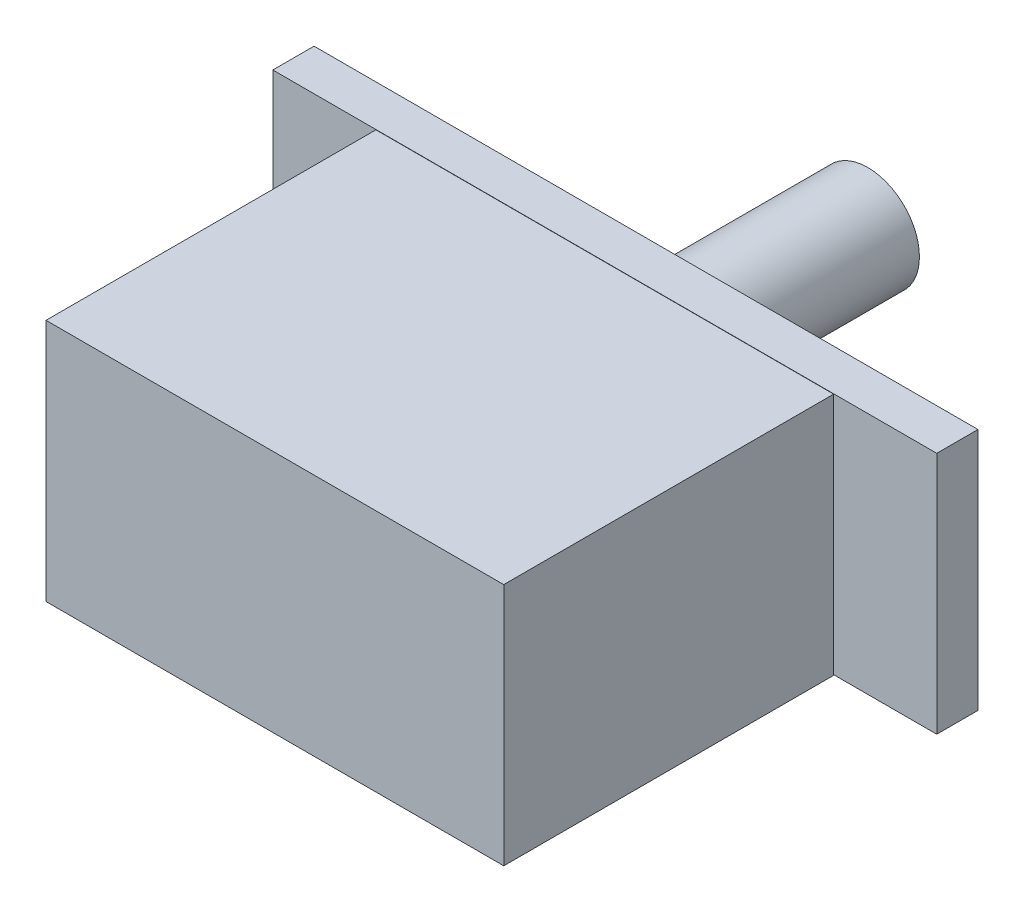
ISO-10303-21;
HEADER;
FILE_DESCRIPTION(('STEP AP214'),'2;1');
FILE_NAME('part.step','',(''),(''),'','','');
FILE_SCHEMA(('AUTOMOTIVE_DESIGN { 1 0 10303 214 1 1 1 1 }'));
ENDSEC;
DATA;
#1=APPLICATION_CONTEXT('core data for automotive mechanical design processes');
#2=APPLICATION_PROTOCOL_DEFINITION('international standard','automotive_design',2000,#1);
#3=PRODUCT_CONTEXT('',#1,'mechanical');
#4=PRODUCT('Part','Part','',(#3));
#5=PRODUCT_RELATED_PRODUCT_CATEGORY('part','',(#4));
#6=PRODUCT_DEFINITION_FORMATION('','',#4);
#7=PRODUCT_DEFINITION_CONTEXT('part definition',#1,'design');
#8=PRODUCT_DEFINITION('design','',#6,#7);
#9=PRODUCT_DEFINITION_SHAPE('','',#8);
#10=(LENGTH_UNIT() NAMED_UNIT(*) SI_UNIT(.MILLI.,.METRE.));
#11=(NAMED_UNIT(*) PLANE_ANGLE_UNIT() SI_UNIT($,.RADIAN.));
#12=(NAMED_UNIT(*) SI_UNIT($,.STERADIAN.) SOLID_ANGLE_UNIT());
#13=UNCERTAINTY_MEASURE_WITH_UNIT(LENGTH_MEASURE(1.E-05),#10,'distance_accuracy_value','');
#14=(GEOMETRIC_REPRESENTATION_CONTEXT(3) GLOBAL_UNCERTAINTY_ASSIGNED_CONTEXT((#13)) GLOBAL_UNIT_ASSIGNED_CONTEXT((#10,
#11,#12)) REPRESENTATION_CONTEXT('',''));
#15=CARTESIAN_POINT('',(0.,0.,0.));
#16=DIRECTION('',(0.,0.,1.));
#17=DIRECTION('',(1.,0.,0.));
#18=AXIS2_PLACEMENT_3D('',#15,#16,#17);
#19=CARTESIAN_POINT('',(-65.3546528013582,-7.07750424448215,2.));
#20=DIRECTION('',(1.,0.,0.));
#21=DIRECTION('',(0.,0.,-1.));
#22=AXIS2_PLACEMENT_3D('',#19,#20,#21);
#23=PLANE('',#22);
#24=DIRECTION('',(0.,-1.,0.));
#25=VECTOR('',#24,1.);
#26=CARTESIAN_POINT('',(-65.3546528013582,-7.07750424448215,0.));
#27=LINE('',#26,#25);
#28=CARTESIAN_POINT('',(-65.3546528013582,-7.07750424448215,0.));
#29=VERTEX_POINT('',#28);
#30=CARTESIAN_POINT('',(-65.3546528013582,-18.8775042444822,0.));
#31=VERTEX_POINT('',#30);
#32=EDGE_CURVE('E127',#29,#31,#27,.T.);
#33=ORIENTED_EDGE('',*,*,#32,.T.);
#34=DIRECTION('',(0.,0.,-1.));
#35=VECTOR('',#34,1.);
#36=CARTESIAN_POINT('',(-65.3546528013582,-18.8775042444822,2.));
#37=LINE('',#36,#35);
#38=CARTESIAN_POINT('',(-65.3546528013582,-18.8775042444822,2.));
#39=VERTEX_POINT('',#38);
#40=EDGE_CURVE('E160',#39,#31,#37,.T.);
#41=ORIENTED_EDGE('',*,*,#40,.F.);
#42=DIRECTION('',(0.,-1.,0.));
#43=VECTOR('',#42,1.);
#44=CARTESIAN_POINT('',(-65.3546528013582,-7.07750424448215,2.));
#45=LINE('',#44,#43);
#46=CARTESIAN_POINT('',(-65.3546528013582,-7.07750424448215,2.));
#47=VERTEX_POINT('',#46);
#48=EDGE_CURVE('E136',#47,#39,#45,.T.);
#49=ORIENTED_EDGE('',*,*,#48,.F.);
#50=DIRECTION('',(0.,0.,-1.));
#51=VECTOR('',#50,1.);
#52=CARTESIAN_POINT('',(-65.3546528013582,-7.07750424448215,2.));
#53=LINE('',#52,#51);
#54=EDGE_CURVE('E147',#47,#29,#53,.T.);
#55=ORIENTED_EDGE('',*,*,#54,.T.);
#56=EDGE_LOOP('',(#33,#41,#49,#55));
#57=FACE_BOUND('',#56,.T.);
#58=ADVANCED_FACE('F33',(#57),#23,.F.);
#59=CARTESIAN_POINT('',(-65.3546528013582,-18.8775042444822,2.));
#60=DIRECTION('',(0.,1.,0.));
#61=DIRECTION('',(0.,0.,1.));
#62=AXIS2_PLACEMENT_3D('',#59,#60,#61);
#63=PLANE('',#62);
#64=DIRECTION('',(1.,0.,0.));
#65=VECTOR('',#64,1.);
#66=CARTESIAN_POINT('',(-65.3546528013582,-18.8775042444822,0.));
#67=LINE('',#66,#65);
#68=CARTESIAN_POINT('',(-33.1546528013582,-18.8775042444822,0.));
#69=VERTEX_POINT('',#68);
#70=EDGE_CURVE('E130',#31,#69,#67,.T.);
#71=ORIENTED_EDGE('',*,*,#70,.T.);
#72=DIRECTION('',(0.,0.,-1.));
#73=VECTOR('',#72,1.);
#74=CARTESIAN_POINT('',(-33.1546528013582,-18.8775042444822,2.));
#75=LINE('',#74,#73);
#76=CARTESIAN_POINT('',(-33.1546528013582,-18.8775042444822,2.));
#77=VERTEX_POINT('',#76);
#78=EDGE_CURVE('E158',#77,#69,#75,.T.);
#79=ORIENTED_EDGE('',*,*,#78,.F.);
#80=DIRECTION('',(1.,0.,0.));
#81=VECTOR('',#80,1.);
#82=CARTESIAN_POINT('',(-65.3546528013582,-18.8775042444822,2.));
#83=LINE('',#82,#81);
#84=CARTESIAN_POINT('',(-38.1546528013582,-18.8775042444822,2.));
#85=VERTEX_POINT('',#84);
#86=EDGE_CURVE('E139',#85,#77,#83,.T.);
#87=ORIENTED_EDGE('',*,*,#86,.F.);
#88=CARTESIAN_POINT('',(-60.3546528013582,-18.8775042444822,2.));
#89=VERTEX_POINT('',#88);
#90=EDGE_CURVE('E144',#89,#85,#83,.T.);
#91=ORIENTED_EDGE('',*,*,#90,.F.);
#92=EDGE_CURVE('E141',#39,#89,#83,.T.);
#93=ORIENTED_EDGE('',*,*,#92,.F.);
#94=ORIENTED_EDGE('',*,*,#40,.T.);
#95=EDGE_LOOP('',(#71,#79,#87,#91,#93,#94));
#96=FACE_BOUND('',#95,.T.);
#97=ADVANCED_FACE('F211',(#96),#63,.F.);
#98=CARTESIAN_POINT('',(-33.1546528013582,-7.07750424448215,2.));
#99=DIRECTION('',(-1.,0.,0.));
#100=DIRECTION('',(0.,0.,1.));
#101=AXIS2_PLACEMENT_3D('',#98,#99,#100);
#102=PLANE('',#101);
#103=DIRECTION('',(0.,1.,0.));
#104=VECTOR('',#103,1.);
#105=CARTESIAN_POINT('',(-33.1546528013582,-7.07750424448215,0.));
#106=LINE('',#105,#104);
#107=CARTESIAN_POINT('',(-33.1546528013582,-7.07750424448215,0.));
#108=VERTEX_POINT('',#107);
#109=EDGE_CURVE('E150',#69,#108,#106,.T.);
#110=ORIENTED_EDGE('',*,*,#109,.T.);
#111=DIRECTION('',(0.,0.,-1.));
#112=VECTOR('',#111,1.);
#113=CARTESIAN_POINT('',(-33.1546528013582,-7.07750424448215,2.));
#114=LINE('',#113,#112);
#115=CARTESIAN_POINT('',(-33.1546528013582,-7.07750424448215,2.));
#116=VERTEX_POINT('',#115);
#117=EDGE_CURVE('E155',#116,#108,#114,.T.);
#118=ORIENTED_EDGE('',*,*,#117,.F.);
#119=DIRECTION('',(0.,1.,0.));
#120=VECTOR('',#119,1.);
#121=CARTESIAN_POINT('',(-33.1546528013582,-7.07750424448215,2.));
#122=LINE('',#121,#120);
#123=EDGE_CURVE('E143',#77,#116,#122,.T.);
#124=ORIENTED_EDGE('',*,*,#123,.F.);
#125=ORIENTED_EDGE('',*,*,#78,.T.);
#126=EDGE_LOOP('',(#110,#118,#124,#125));
#127=FACE_BOUND('',#126,.T.);
#128=ADVANCED_FACE('F209',(#127),#102,.F.);
#129=CARTESIAN_POINT('',(-65.3546528013582,-7.07750424448215,2.));
#130=DIRECTION('',(0.,-1.,0.));
#131=DIRECTION('',(0.,0.,-1.));
#132=AXIS2_PLACEMENT_3D('',#129,#130,#131);
#133=PLANE('',#132);
#134=DIRECTION('',(-1.,0.,0.));
#135=VECTOR('',#134,1.);
#136=CARTESIAN_POINT('',(-65.3546528013582,-7.07750424448215,0.));
#137=LINE('',#136,#135);
#138=EDGE_CURVE('E140',#108,#29,#137,.T.);
#139=ORIENTED_EDGE('',*,*,#138,.T.);
#140=ORIENTED_EDGE('',*,*,#54,.F.);
#141=DIRECTION('',(-1.,0.,0.));
#142=VECTOR('',#141,1.);
#143=CARTESIAN_POINT('',(-65.3546528013582,-7.07750424448215,2.));
#144=LINE('',#143,#142);
#145=EDGE_CURVE('E146',#116,#47,#144,.T.);
#146=ORIENTED_EDGE('',*,*,#145,.F.);
#147=ORIENTED_EDGE('',*,*,#117,.T.);
#148=EDGE_LOOP('',(#139,#140,#146,#147));
#149=FACE_BOUND('',#148,.T.);
#150=ADVANCED_FACE('F205',(#149),#133,.F.);
#151=CARTESIAN_POINT('',(0.,0.,2.));
#152=DIRECTION('',(0.,0.,1.));
#153=DIRECTION('',(1.,0.,0.));
#154=AXIS2_PLACEMENT_3D('',#151,#152,#153);
#155=PLANE('',#154);
#156=DIRECTION('',(0.,-1.,0.));
#157=VECTOR('',#156,1.);
#158=CARTESIAN_POINT('',(-60.3546528013582,-18.9041740383686,2.));
#159=LINE('',#158,#157);
#160=CARTESIAN_POINT('',(-60.3546528013582,-7.09157997573584,2.));
#161=VERTEX_POINT('',#160);
#162=EDGE_CURVE('E47',#161,#89,#159,.T.);
#163=ORIENTED_EDGE('',*,*,#162,.F.);
#164=DIRECTION('',(-1.,0.,0.));
#165=VECTOR('',#164,1.);
#166=CARTESIAN_POINT('',(-60.3546528013582,-7.09157997573584,2.));
#167=LINE('',#166,#165);
#168=CARTESIAN_POINT('',(-38.1546528013582,-7.09157997573584,2.));
#169=VERTEX_POINT('',#168);
#170=EDGE_CURVE('E121',#169,#161,#167,.T.);
#171=ORIENTED_EDGE('',*,*,#170,.F.);
#172=DIRECTION('',(0.,1.,0.));
#173=VECTOR('',#172,1.);
#174=CARTESIAN_POINT('',(-38.1546528013582,-18.9041740383686,2.));
#175=LINE('',#174,#173);
#176=EDGE_CURVE('E40',#85,#169,#175,.T.);
#177=ORIENTED_EDGE('',*,*,#176,.F.);
#178=ORIENTED_EDGE('',*,*,#86,.T.);
#179=ORIENTED_EDGE('',*,*,#123,.T.);
#180=ORIENTED_EDGE('',*,*,#145,.T.);
#181=ORIENTED_EDGE('',*,*,#48,.T.);
#182=ORIENTED_EDGE('',*,*,#92,.T.);
#183=EDGE_LOOP('',(#163,#171,#177,#178,#179,#180,#181,#182));
#184=FACE_BOUND('',#183,.T.);
#185=ADVANCED_FACE('F195',(#184),#155,.T.);
#186=CARTESIAN_POINT('',(0.,0.,0.));
#187=DIRECTION('',(0.,0.,1.));
#188=DIRECTION('',(1.,0.,0.));
#189=AXIS2_PLACEMENT_3D('',#186,#187,#188);
#190=PLANE('',#189);
#191=CARTESIAN_POINT('',(-50.495961023401,-13.245250527973,0.));
#192=DIRECTION('',(0.,0.,1.));
#193=DIRECTION('',(1.,0.,0.));
#194=AXIS2_PLACEMENT_3D('',#191,#192,#193);
#195=CIRCLE('',#194,2.5);
#196=CARTESIAN_POINT('',(-47.995961023401,-13.245250527973,0.));
#197=VERTEX_POINT('',#196);
#198=EDGE_CURVE('E11',#197,#197,#195,.F.);
#199=ORIENTED_EDGE('',*,*,#198,.F.);
#200=EDGE_LOOP('',(#199));
#201=FACE_BOUND('',#200,.T.);
#202=ORIENTED_EDGE('',*,*,#32,.F.);
#203=ORIENTED_EDGE('',*,*,#138,.F.);
#204=ORIENTED_EDGE('',*,*,#109,.F.);
#205=ORIENTED_EDGE('',*,*,#70,.F.);
#206=EDGE_LOOP('',(#202,#203,#204,#205));
#207=FACE_BOUND('',#206,.T.);
#208=ADVANCED_FACE('F192',(#201,#207),#190,.F.);
#209=CARTESIAN_POINT('',(-60.3546528013582,-18.9041740383686,18.));
#210=DIRECTION('',(1.,0.,0.));
#211=DIRECTION('',(0.,0.,-1.));
#212=AXIS2_PLACEMENT_3D('',#209,#210,#211);
#213=PLANE('',#212);
#214=ORIENTED_EDGE('',*,*,#162,.T.);
#215=CARTESIAN_POINT('',(-60.3546528013582,-18.9041740383686,2.));
#216=VERTEX_POINT('',#215);
#217=EDGE_CURVE('E125',#89,#216,#159,.T.);
#218=ORIENTED_EDGE('',*,*,#217,.T.);
#219=DIRECTION('',(0.,0.,-1.));
#220=VECTOR('',#219,1.);
#221=CARTESIAN_POINT('',(-60.3546528013582,-18.9041740383686,18.));
#222=LINE('',#221,#220);
#223=CARTESIAN_POINT('',(-60.3546528013582,-18.9041740383686,18.));
#224=VERTEX_POINT('',#223);
#225=EDGE_CURVE('E106',#224,#216,#222,.T.);
#226=ORIENTED_EDGE('',*,*,#225,.F.);
#227=DIRECTION('',(0.,-1.,0.));
#228=VECTOR('',#227,1.);
#229=CARTESIAN_POINT('',(-60.3546528013582,-18.9041740383686,18.));
#230=LINE('',#229,#228);
#231=CARTESIAN_POINT('',(-60.3546528013582,-7.09157997573584,18.));
#232=VERTEX_POINT('',#231);
#233=EDGE_CURVE('E112',#232,#224,#230,.T.);
#234=ORIENTED_EDGE('',*,*,#233,.F.);
#235=DIRECTION('',(0.,0.,-1.));
#236=VECTOR('',#235,1.);
#237=CARTESIAN_POINT('',(-60.3546528013582,-7.09157997573584,18.));
#238=LINE('',#237,#236);
#239=EDGE_CURVE('E177',#232,#161,#238,.T.);
#240=ORIENTED_EDGE('',*,*,#239,.T.);
#241=EDGE_LOOP('',(#214,#218,#226,#234,#240));
#242=FACE_BOUND('',#241,.T.);
#243=ADVANCED_FACE('F123',(#242),#213,.F.);
#244=CARTESIAN_POINT('',(-60.3546528013582,-18.9041740383686,18.));
#245=DIRECTION('',(0.,1.,0.));
#246=DIRECTION('',(0.,0.,1.));
#247=AXIS2_PLACEMENT_3D('',#244,#245,#246);
#248=PLANE('',#247);
#249=DIRECTION('',(1.,0.,0.));
#250=VECTOR('',#249,1.);
#251=CARTESIAN_POINT('',(-60.3546528013582,-18.9041740383686,2.));
#252=LINE('',#251,#250);
#253=CARTESIAN_POINT('',(-38.1546528013582,-18.9041740383686,2.));
#254=VERTEX_POINT('',#253);
#255=EDGE_CURVE('E172',#216,#254,#252,.T.);
#256=ORIENTED_EDGE('',*,*,#255,.T.);
#257=DIRECTION('',(0.,0.,-1.));
#258=VECTOR('',#257,1.);
#259=CARTESIAN_POINT('',(-38.1546528013582,-18.9041740383686,18.));
#260=LINE('',#259,#258);
#261=CARTESIAN_POINT('',(-38.1546528013582,-18.9041740383686,18.));
#262=VERTEX_POINT('',#261);
#263=EDGE_CURVE('E108',#262,#254,#260,.T.);
#264=ORIENTED_EDGE('',*,*,#263,.F.);
#265=DIRECTION('',(1.,0.,0.));
#266=VECTOR('',#265,1.);
#267=CARTESIAN_POINT('',(-60.3546528013582,-18.9041740383686,18.));
#268=LINE('',#267,#266);
#269=EDGE_CURVE('E102',#224,#262,#268,.T.);
#270=ORIENTED_EDGE('',*,*,#269,.F.);
#271=ORIENTED_EDGE('',*,*,#225,.T.);
#272=EDGE_LOOP('',(#256,#264,#270,#271));
#273=FACE_BOUND('',#272,.T.);
#274=ADVANCED_FACE('F104',(#273),#248,.F.);
#275=CARTESIAN_POINT('',(-38.1546528013582,-18.9041740383686,18.));
#276=DIRECTION('',(-1.,0.,0.));
#277=DIRECTION('',(0.,0.,1.));
#278=AXIS2_PLACEMENT_3D('',#275,#276,#277);
#279=PLANE('',#278);
#280=EDGE_CURVE('E165',#254,#85,#175,.T.);
#281=ORIENTED_EDGE('',*,*,#280,.T.);
#282=ORIENTED_EDGE('',*,*,#176,.T.);
#283=DIRECTION('',(0.,0.,-1.));
#284=VECTOR('',#283,1.);
#285=CARTESIAN_POINT('',(-38.1546528013582,-7.09157997573584,18.));
#286=LINE('',#285,#284);
#287=CARTESIAN_POINT('',(-38.1546528013582,-7.09157997573584,18.));
#288=VERTEX_POINT('',#287);
#289=EDGE_CURVE('E132',#288,#169,#286,.T.);
#290=ORIENTED_EDGE('',*,*,#289,.F.);
#291=DIRECTION('',(0.,1.,0.));
#292=VECTOR('',#291,1.);
#293=CARTESIAN_POINT('',(-38.1546528013582,-18.9041740383686,18.));
#294=LINE('',#293,#292);
#295=EDGE_CURVE('E111',#262,#288,#294,.T.);
#296=ORIENTED_EDGE('',*,*,#295,.F.);
#297=ORIENTED_EDGE('',*,*,#263,.T.);
#298=EDGE_LOOP('',(#281,#282,#290,#296,#297));
#299=FACE_BOUND('',#298,.T.);
#300=ADVANCED_FACE('F217',(#299),#279,.F.);
#301=CARTESIAN_POINT('',(-60.3546528013582,-7.09157997573584,18.));
#302=DIRECTION('',(0.,-1.,0.));
#303=DIRECTION('',(0.,0.,-1.));
#304=AXIS2_PLACEMENT_3D('',#301,#302,#303);
#305=PLANE('',#304);
#306=ORIENTED_EDGE('',*,*,#170,.T.);
#307=ORIENTED_EDGE('',*,*,#239,.F.);
#308=DIRECTION('',(-1.,0.,0.));
#309=VECTOR('',#308,1.);
#310=CARTESIAN_POINT('',(-60.3546528013582,-7.09157997573584,18.));
#311=LINE('',#310,#309);
#312=EDGE_CURVE('E117',#288,#232,#311,.T.);
#313=ORIENTED_EDGE('',*,*,#312,.F.);
#314=ORIENTED_EDGE('',*,*,#289,.T.);
#315=EDGE_LOOP('',(#306,#307,#313,#314));
#316=FACE_BOUND('',#315,.T.);
#317=ADVANCED_FACE('F216',(#316),#305,.F.);
#318=CARTESIAN_POINT('',(0.,0.,18.));
#319=DIRECTION('',(0.,0.,-1.));
#320=DIRECTION('',(-1.,0.,0.));
#321=AXIS2_PLACEMENT_3D('',#318,#319,#320);
#322=PLANE('',#321);
#323=ORIENTED_EDGE('',*,*,#233,.T.);
#324=ORIENTED_EDGE('',*,*,#269,.T.);
#325=ORIENTED_EDGE('',*,*,#295,.T.);
#326=ORIENTED_EDGE('',*,*,#312,.T.);
#327=EDGE_LOOP('',(#323,#324,#325,#326));
#328=FACE_BOUND('',#327,.T.);
#329=ADVANCED_FACE('F115',(#328),#322,.F.);
#330=CARTESIAN_POINT('',(0.,0.,2.));
#331=DIRECTION('',(0.,0.,-1.));
#332=DIRECTION('',(-1.,0.,0.));
#333=AXIS2_PLACEMENT_3D('',#330,#331,#332);
#334=PLANE('',#333);
#335=ORIENTED_EDGE('',*,*,#217,.F.);
#336=ORIENTED_EDGE('',*,*,#90,.T.);
#337=ORIENTED_EDGE('',*,*,#280,.F.);
#338=ORIENTED_EDGE('',*,*,#255,.F.);
#339=EDGE_LOOP('',(#335,#336,#337,#338));
#340=FACE_BOUND('',#339,.T.);
#341=ADVANCED_FACE('F188',(#340),#334,.T.);
#342=CARTESIAN_POINT('',(-50.495961023401,-13.245250527973,-12.));
#343=DIRECTION('',(0.,0.,1.));
#344=DIRECTION('',(1.,0.,0.));
#345=AXIS2_PLACEMENT_3D('',#342,#343,#344);
#346=CYLINDRICAL_SURFACE('',#345,2.5);
#347=CARTESIAN_POINT('',(-50.495961023401,-13.245250527973,-12.));
#348=DIRECTION('',(0.,0.,-1.));
#349=DIRECTION('',(-1.,0.,0.));
#350=AXIS2_PLACEMENT_3D('',#347,#348,#349);
#351=CIRCLE('',#350,2.5);
#352=CARTESIAN_POINT('',(-52.995961023401,-13.245250527973,-12.));
#353=VERTEX_POINT('',#352);
#354=EDGE_CURVE('E179',#353,#353,#351,.T.);
#355=ORIENTED_EDGE('',*,*,#354,.F.);
#356=EDGE_LOOP('',(#355));
#357=FACE_BOUND('',#356,.T.);
#358=ORIENTED_EDGE('',*,*,#198,.T.);
#359=EDGE_LOOP('',(#358));
#360=FACE_BOUND('',#359,.T.);
#361=ADVANCED_FACE('F185',(#357,#360),#346,.T.);
#362=CARTESIAN_POINT('',(-50.495961023401,-13.245250527973,-12.));
#363=DIRECTION('',(0.,0.,-1.));
#364=DIRECTION('',(-1.,0.,0.));
#365=AXIS2_PLACEMENT_3D('',#362,#363,#364);
#366=PLANE('',#365);
#367=ORIENTED_EDGE('',*,*,#354,.T.);
#368=EDGE_LOOP('',(#367));
#369=FACE_BOUND('',#368,.T.);
#370=ADVANCED_FACE('F183',(#369),#366,.T.);
#371=CLOSED_SHELL('',(#58,#97,#128,#150,#185,#208,#243,#274,#300,#317,#329,#341,#361,#370));
#372=MANIFOLD_SOLID_BREP('B2',#371);
#373=ADVANCED_BREP_SHAPE_REPRESENTATION('',(#18,#372),#14);
#374=SHAPE_DEFINITION_REPRESENTATION(#9,#373);
ENDSEC;
END-ISO-10303-21;
